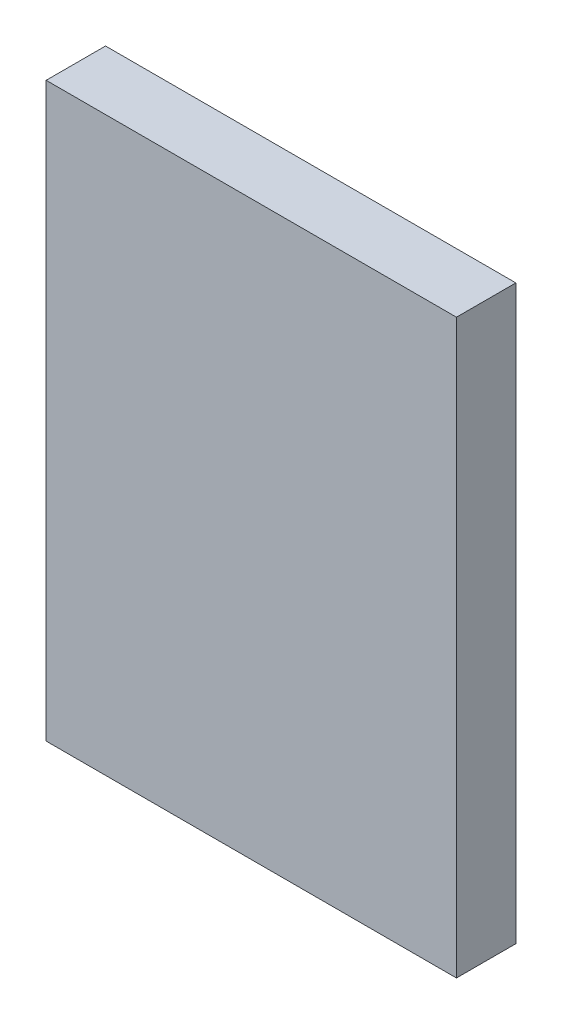
ISO-10303-21;
HEADER;
FILE_DESCRIPTION(('STEP AP214'),'2;1');
FILE_NAME('part.step','',(''),(''),'','','');
FILE_SCHEMA(('AUTOMOTIVE_DESIGN { 1 0 10303 214 1 1 1 1 }'));
ENDSEC;
DATA;
#1=APPLICATION_CONTEXT('core data for automotive mechanical design processes');
#2=APPLICATION_PROTOCOL_DEFINITION('international standard','automotive_design',2000,#1);
#3=PRODUCT_CONTEXT('',#1,'mechanical');
#4=PRODUCT('Part','Part','',(#3));
#5=PRODUCT_RELATED_PRODUCT_CATEGORY('part','',(#4));
#6=PRODUCT_DEFINITION_FORMATION('','',#4);
#7=PRODUCT_DEFINITION_CONTEXT('part definition',#1,'design');
#8=PRODUCT_DEFINITION('design','',#6,#7);
#9=PRODUCT_DEFINITION_SHAPE('','',#8);
#10=(LENGTH_UNIT() NAMED_UNIT(*) SI_UNIT(.MILLI.,.METRE.));
#11=(NAMED_UNIT(*) PLANE_ANGLE_UNIT() SI_UNIT($,.RADIAN.));
#12=(NAMED_UNIT(*) SI_UNIT($,.STERADIAN.) SOLID_ANGLE_UNIT());
#13=UNCERTAINTY_MEASURE_WITH_UNIT(LENGTH_MEASURE(1.E-05),#10,'distance_accuracy_value','');
#14=(GEOMETRIC_REPRESENTATION_CONTEXT(3) GLOBAL_UNCERTAINTY_ASSIGNED_CONTEXT((#13)) GLOBAL_UNIT_ASSIGNED_CONTEXT((#10,
#11,#12)) REPRESENTATION_CONTEXT('',''));
#15=CARTESIAN_POINT('',(0.,0.,0.));
#16=DIRECTION('',(0.,0.,1.));
#17=DIRECTION('',(1.,0.,0.));
#18=AXIS2_PLACEMENT_3D('',#15,#16,#17);
#19=CARTESIAN_POINT('',(0.,0.,1.10000034));
#20=DIRECTION('',(0.,0.,1.));
#21=DIRECTION('',(1.,0.,0.));
#22=AXIS2_PLACEMENT_3D('',#19,#20,#21);
#23=PLANE('',#22);
#24=DIRECTION('',(0.,1.,0.));
#25=VECTOR('',#24,1.);
#26=CARTESIAN_POINT('',(-3.80000002,-5.29999956,1.100000340327));
#27=LINE('',#26,#25);
#28=CARTESIAN_POINT('',(-3.80000002,-5.29999956,1.100000340327));
#29=VERTEX_POINT('',#28);
#30=CARTESIAN_POINT('',(-3.80000002,5.29999956,1.100000340327));
#31=VERTEX_POINT('',#30);
#32=EDGE_CURVE('E11',#29,#31,#27,.T.);
#33=ORIENTED_EDGE('',*,*,#32,.F.);
#34=DIRECTION('',(-1.,0.,0.));
#35=VECTOR('',#34,1.);
#36=CARTESIAN_POINT('',(3.800000020203,-5.29999956,1.100000340327));
#37=LINE('',#36,#35);
#38=CARTESIAN_POINT('',(3.800000020203,-5.29999956,1.100000340327));
#39=VERTEX_POINT('',#38);
#40=EDGE_CURVE('E85',#39,#29,#37,.T.);
#41=ORIENTED_EDGE('',*,*,#40,.F.);
#42=DIRECTION('',(1.918243501198E-11,-1.,0.));
#43=VECTOR('',#42,1.);
#44=CARTESIAN_POINT('',(3.80000002,5.29999956,1.100000340327));
#45=LINE('',#44,#43);
#46=CARTESIAN_POINT('',(3.80000002,5.29999956,1.100000340327));
#47=VERTEX_POINT('',#46);
#48=EDGE_CURVE('E70',#47,#39,#45,.T.);
#49=ORIENTED_EDGE('',*,*,#48,.F.);
#50=DIRECTION('',(1.,0.,0.));
#51=VECTOR('',#50,1.);
#52=CARTESIAN_POINT('',(-3.80000002,5.29999956,1.100000340327));
#53=LINE('',#52,#51);
#54=EDGE_CURVE('E51',#31,#47,#53,.T.);
#55=ORIENTED_EDGE('',*,*,#54,.F.);
#56=EDGE_LOOP('',(#33,#41,#49,#55));
#57=FACE_BOUND('',#56,.T.);
#58=ADVANCED_FACE('F18',(#57),#23,.T.);
#59=CARTESIAN_POINT('',(-3.80000002,5.29999956,0.));
#60=DIRECTION('',(-1.,0.,0.));
#61=DIRECTION('',(0.,0.,1.));
#62=AXIS2_PLACEMENT_3D('',#59,#60,#61);
#63=PLANE('',#62);
#64=ORIENTED_EDGE('',*,*,#32,.T.);
#65=DIRECTION('',(1.909086439227E-10,-2.121211640445E-10,-1.));
#66=VECTOR('',#65,1.);
#67=CARTESIAN_POINT('',(-3.80000002,5.29999956,1.100000340327));
#68=LINE('',#67,#66);
#69=CARTESIAN_POINT('',(-3.80000001979,5.299999559767,0.));
#70=VERTEX_POINT('',#69);
#71=EDGE_CURVE('E28',#31,#70,#68,.T.);
#72=ORIENTED_EDGE('',*,*,#71,.T.);
#73=DIRECTION('',(0.,1.,0.));
#74=VECTOR('',#73,1.);
#75=CARTESIAN_POINT('',(-3.80000001979,-5.299999559767,0.));
#76=LINE('',#75,#74);
#77=CARTESIAN_POINT('',(-3.80000001979,-5.299999559767,0.));
#78=VERTEX_POINT('',#77);
#79=EDGE_CURVE('E104',#78,#70,#76,.T.);
#80=ORIENTED_EDGE('',*,*,#79,.F.);
#81=DIRECTION('',(1.909086439227E-10,2.121211640445E-10,-1.));
#82=VECTOR('',#81,1.);
#83=CARTESIAN_POINT('',(-3.80000002,-5.29999956,1.100000340327));
#84=LINE('',#83,#82);
#85=EDGE_CURVE('E90',#29,#78,#84,.T.);
#86=ORIENTED_EDGE('',*,*,#85,.F.);
#87=EDGE_LOOP('',(#64,#72,#80,#86));
#88=FACE_BOUND('',#87,.T.);
#89=ADVANCED_FACE('F20',(#88),#63,.T.);
#90=CARTESIAN_POINT('',(3.80000002,5.29999956,0.));
#91=DIRECTION('',(0.,1.,0.));
#92=DIRECTION('',(1.,0.,0.));
#93=AXIS2_PLACEMENT_3D('',#90,#91,#92);
#94=PLANE('',#93);
#95=ORIENTED_EDGE('',*,*,#54,.T.);
#96=DIRECTION('',(-1.909086439227E-10,-2.121211640445E-10,-1.));
#97=VECTOR('',#96,1.);
#98=CARTESIAN_POINT('',(3.80000002,5.29999956,1.100000340327));
#99=LINE('',#98,#97);
#100=CARTESIAN_POINT('',(3.80000001979,5.299999559767,0.));
#101=VERTEX_POINT('',#100);
#102=EDGE_CURVE('E76',#47,#101,#99,.T.);
#103=ORIENTED_EDGE('',*,*,#102,.T.);
#104=DIRECTION('',(1.,0.,0.));
#105=VECTOR('',#104,1.);
#106=CARTESIAN_POINT('',(-3.80000001979,5.299999559767,0.));
#107=LINE('',#106,#105);
#108=EDGE_CURVE('E108',#70,#101,#107,.T.);
#109=ORIENTED_EDGE('',*,*,#108,.F.);
#110=ORIENTED_EDGE('',*,*,#71,.F.);
#111=EDGE_LOOP('',(#95,#103,#109,#110));
#112=FACE_BOUND('',#111,.T.);
#113=ADVANCED_FACE('F121',(#112),#94,.T.);
#114=CARTESIAN_POINT('',(3.80000002,-5.29999956,0.));
#115=DIRECTION('',(1.,0.,0.));
#116=DIRECTION('',(0.,1.,0.));
#117=AXIS2_PLACEMENT_3D('',#114,#115,#116);
#118=PLANE('',#117);
#119=ORIENTED_EDGE('',*,*,#48,.T.);
#120=DIRECTION('',(-1.909094513574E-10,2.121211640445E-10,-1.));
#121=VECTOR('',#120,1.);
#122=CARTESIAN_POINT('',(3.800000020203,-5.29999956,1.100000340327));
#123=LINE('',#122,#121);
#124=CARTESIAN_POINT('',(3.800000019993,-5.299999559767,0.));
#125=VERTEX_POINT('',#124);
#126=EDGE_CURVE('E74',#39,#125,#123,.T.);
#127=ORIENTED_EDGE('',*,*,#126,.T.);
#128=DIRECTION('',(1.918239311761E-11,-1.,0.));
#129=VECTOR('',#128,1.);
#130=CARTESIAN_POINT('',(3.80000001979,5.299999559767,0.));
#131=LINE('',#130,#129);
#132=EDGE_CURVE('E22',#101,#125,#131,.T.);
#133=ORIENTED_EDGE('',*,*,#132,.F.);
#134=ORIENTED_EDGE('',*,*,#102,.F.);
#135=EDGE_LOOP('',(#119,#127,#133,#134));
#136=FACE_BOUND('',#135,.T.);
#137=ADVANCED_FACE('F72',(#136),#118,.T.);
#138=CARTESIAN_POINT('',(-3.80000002,-5.29999956,0.));
#139=DIRECTION('',(0.,-1.,0.));
#140=DIRECTION('',(0.,0.,-1.));
#141=AXIS2_PLACEMENT_3D('',#138,#139,#140);
#142=PLANE('',#141);
#143=ORIENTED_EDGE('',*,*,#40,.T.);
#144=ORIENTED_EDGE('',*,*,#85,.T.);
#145=DIRECTION('',(-1.,0.,0.));
#146=VECTOR('',#145,1.);
#147=CARTESIAN_POINT('',(3.800000019993,-5.299999559767,0.));
#148=LINE('',#147,#146);
#149=EDGE_CURVE('E87',#125,#78,#148,.T.);
#150=ORIENTED_EDGE('',*,*,#149,.F.);
#151=ORIENTED_EDGE('',*,*,#126,.F.);
#152=EDGE_LOOP('',(#143,#144,#150,#151));
#153=FACE_BOUND('',#152,.T.);
#154=ADVANCED_FACE('F83',(#153),#142,.T.);
#155=CARTESIAN_POINT('',(0.,0.,0.));
#156=DIRECTION('',(0.,0.,1.));
#157=DIRECTION('',(1.,0.,0.));
#158=AXIS2_PLACEMENT_3D('',#155,#156,#157);
#159=PLANE('',#158);
#160=ORIENTED_EDGE('',*,*,#79,.T.);
#161=ORIENTED_EDGE('',*,*,#108,.T.);
#162=ORIENTED_EDGE('',*,*,#132,.T.);
#163=ORIENTED_EDGE('',*,*,#149,.T.);
#164=EDGE_LOOP('',(#160,#161,#162,#163));
#165=FACE_BOUND('',#164,.T.);
#166=ADVANCED_FACE('F123',(#165),#159,.F.);
#167=CLOSED_SHELL('',(#58,#89,#113,#137,#154,#166));
#168=MANIFOLD_SOLID_BREP('B1',#167);
#169=ADVANCED_BREP_SHAPE_REPRESENTATION('',(#18,#168),#14);
#170=SHAPE_DEFINITION_REPRESENTATION(#9,#169);
ENDSEC;
END-ISO-10303-21;
